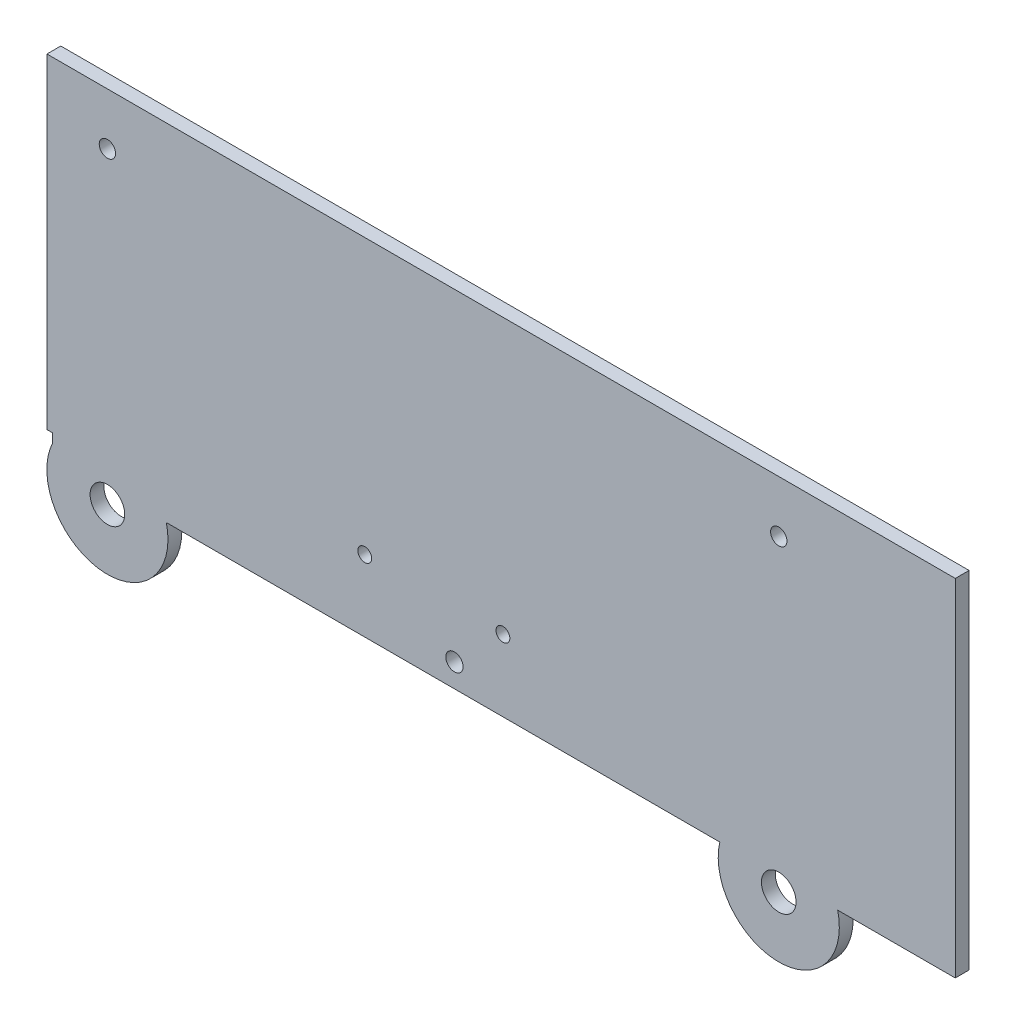
ISO-10303-21;
HEADER;
FILE_DESCRIPTION(('STEP AP214'),'2;1');
FILE_NAME('part.step','',(''),(''),'','','');
FILE_SCHEMA(('AUTOMOTIVE_DESIGN { 1 0 10303 214 1 1 1 1 }'));
ENDSEC;
DATA;
#1=APPLICATION_CONTEXT('core data for automotive mechanical design processes');
#2=APPLICATION_PROTOCOL_DEFINITION('international standard','automotive_design',2000,#1);
#3=PRODUCT_CONTEXT('',#1,'mechanical');
#4=PRODUCT('Part','Part','',(#3));
#5=PRODUCT_RELATED_PRODUCT_CATEGORY('part','',(#4));
#6=PRODUCT_DEFINITION_FORMATION('','',#4);
#7=PRODUCT_DEFINITION_CONTEXT('part definition',#1,'design');
#8=PRODUCT_DEFINITION('design','',#6,#7);
#9=PRODUCT_DEFINITION_SHAPE('','',#8);
#10=(LENGTH_UNIT() NAMED_UNIT(*) SI_UNIT(.MILLI.,.METRE.));
#11=(NAMED_UNIT(*) PLANE_ANGLE_UNIT() SI_UNIT($,.RADIAN.));
#12=(NAMED_UNIT(*) SI_UNIT($,.STERADIAN.) SOLID_ANGLE_UNIT());
#13=UNCERTAINTY_MEASURE_WITH_UNIT(LENGTH_MEASURE(1.E-05),#10,'distance_accuracy_value','');
#14=(GEOMETRIC_REPRESENTATION_CONTEXT(3) GLOBAL_UNCERTAINTY_ASSIGNED_CONTEXT((#13)) GLOBAL_UNIT_ASSIGNED_CONTEXT((#10,
#11,#12)) REPRESENTATION_CONTEXT('',''));
#15=CARTESIAN_POINT('',(0.,0.,0.));
#16=DIRECTION('',(0.,0.,1.));
#17=DIRECTION('',(1.,0.,0.));
#18=AXIS2_PLACEMENT_3D('',#15,#16,#17);
#19=CARTESIAN_POINT('',(0.,-31.75,-5.07492));
#20=DIRECTION('',(0.,-1.,0.));
#21=DIRECTION('',(0.,0.,-1.));
#22=AXIS2_PLACEMENT_3D('',#19,#20,#21);
#23=PLANE('',#22);
#24=DIRECTION('',(0.,0.,-1.));
#25=VECTOR('',#24,1.);
#26=CARTESIAN_POINT('',(101.426359202501,-31.75,0.));
#27=LINE('',#26,#25);
#28=CARTESIAN_POINT('',(101.426359202501,-31.75,0.));
#29=VERTEX_POINT('',#28);
#30=CARTESIAN_POINT('',(101.426359202501,-31.75,-5.07492));
#31=VERTEX_POINT('',#30);
#32=EDGE_CURVE('E209',#29,#31,#27,.T.);
#33=ORIENTED_EDGE('',*,*,#32,.F.);
#34=DIRECTION('',(1.,0.,0.));
#35=VECTOR('',#34,1.);
#36=CARTESIAN_POINT('',(0.,-31.75,0.));
#37=LINE('',#36,#35);
#38=CARTESIAN_POINT('',(-101.680359202501,-31.75,0.));
#39=VERTEX_POINT('',#38);
#40=EDGE_CURVE('E231',#39,#29,#37,.T.);
#41=ORIENTED_EDGE('',*,*,#40,.F.);
#42=DIRECTION('',(0.,0.,-1.));
#43=VECTOR('',#42,1.);
#44=CARTESIAN_POINT('',(-101.680359202501,-31.75,0.));
#45=LINE('',#44,#43);
#46=CARTESIAN_POINT('',(-101.680359202501,-31.75,-5.07492));
#47=VERTEX_POINT('',#46);
#48=EDGE_CURVE('E202',#47,#39,#45,.F.);
#49=ORIENTED_EDGE('',*,*,#48,.F.);
#50=DIRECTION('',(1.,0.,0.));
#51=VECTOR('',#50,1.);
#52=CARTESIAN_POINT('',(0.,-31.75,-5.07492));
#53=LINE('',#52,#51);
#54=EDGE_CURVE('E11',#47,#31,#53,.T.);
#55=ORIENTED_EDGE('',*,*,#54,.T.);
#56=EDGE_LOOP('',(#33,#41,#49,#55));
#57=FACE_BOUND('',#56,.T.);
#58=ADVANCED_FACE('F53',(#57),#23,.T.);
#59=CARTESIAN_POINT('',(-143.383,0.,-5.07492));
#60=DIRECTION('',(1.,0.,0.));
#61=DIRECTION('',(0.,0.,-1.));
#62=AXIS2_PLACEMENT_3D('',#59,#60,#61);
#63=PLANE('',#62);
#64=DIRECTION('',(0.,1.,0.));
#65=VECTOR('',#64,1.);
#66=CARTESIAN_POINT('',(-143.383,0.,0.));
#67=LINE('',#66,#65);
#68=CARTESIAN_POINT('',(-143.383,-27.2745686125639,0.));
#69=VERTEX_POINT('',#68);
#70=CARTESIAN_POINT('',(-143.383,-24.13,0.));
#71=VERTEX_POINT('',#70);
#72=EDGE_CURVE('E239',#69,#71,#67,.T.);
#73=ORIENTED_EDGE('',*,*,#72,.T.);
#74=DIRECTION('',(0.,0.,-1.));
#75=VECTOR('',#74,1.);
#76=CARTESIAN_POINT('',(-143.383,-24.13,-5.07492));
#77=LINE('',#76,#75);
#78=CARTESIAN_POINT('',(-143.383,-24.13,-5.07492));
#79=VERTEX_POINT('',#78);
#80=EDGE_CURVE('E133',#71,#79,#77,.T.);
#81=ORIENTED_EDGE('',*,*,#80,.T.);
#82=DIRECTION('',(0.,1.,0.));
#83=VECTOR('',#82,1.);
#84=CARTESIAN_POINT('',(-143.383,0.,-5.07492));
#85=LINE('',#84,#83);
#86=CARTESIAN_POINT('',(-143.383,-27.2745686125639,-5.07492));
#87=VERTEX_POINT('',#86);
#88=EDGE_CURVE('E63',#87,#79,#85,.T.);
#89=ORIENTED_EDGE('',*,*,#88,.F.);
#90=DIRECTION('',(0.,0.,-1.));
#91=VECTOR('',#90,1.);
#92=CARTESIAN_POINT('',(-143.383,-27.2745686125639,0.));
#93=LINE('',#92,#91);
#94=EDGE_CURVE('E190',#87,#69,#93,.F.);
#95=ORIENTED_EDGE('',*,*,#94,.T.);
#96=EDGE_LOOP('',(#73,#81,#89,#95));
#97=FACE_BOUND('',#96,.T.);
#98=ADVANCED_FACE('F305',(#97),#63,.F.);
#99=CARTESIAN_POINT('',(0.,95.25,-5.07492));
#100=DIRECTION('',(0.,-1.,0.));
#101=DIRECTION('',(0.,0.,-1.));
#102=AXIS2_PLACEMENT_3D('',#99,#100,#101);
#103=PLANE('',#102);
#104=DIRECTION('',(0.,0.,-1.));
#105=VECTOR('',#104,1.);
#106=CARTESIAN_POINT('',(187.833,95.25,0.));
#107=LINE('',#106,#105);
#108=CARTESIAN_POINT('',(187.833,95.25,0.));
#109=VERTEX_POINT('',#108);
#110=CARTESIAN_POINT('',(187.833,95.25,-5.07492));
#111=VERTEX_POINT('',#110);
#112=EDGE_CURVE('E217',#109,#111,#107,.T.);
#113=ORIENTED_EDGE('',*,*,#112,.T.);
#114=DIRECTION('',(1.,0.,0.));
#115=VECTOR('',#114,1.);
#116=CARTESIAN_POINT('',(0.,95.25,-5.07492));
#117=LINE('',#116,#115);
#118=CARTESIAN_POINT('',(-145.5039,95.25,-5.07492));
#119=VERTEX_POINT('',#118);
#120=EDGE_CURVE('E230',#119,#111,#117,.T.);
#121=ORIENTED_EDGE('',*,*,#120,.F.);
#122=DIRECTION('',(0.,0.,-1.));
#123=VECTOR('',#122,1.);
#124=CARTESIAN_POINT('',(-145.5039,95.25,0.));
#125=LINE('',#124,#123);
#126=CARTESIAN_POINT('',(-145.5039,95.25,0.));
#127=VERTEX_POINT('',#126);
#128=EDGE_CURVE('E148',#127,#119,#125,.T.);
#129=ORIENTED_EDGE('',*,*,#128,.F.);
#130=DIRECTION('',(1.,0.,0.));
#131=VECTOR('',#130,1.);
#132=CARTESIAN_POINT('',(0.,95.25,0.));
#133=LINE('',#132,#131);
#134=EDGE_CURVE('E153',#127,#109,#133,.T.);
#135=ORIENTED_EDGE('',*,*,#134,.T.);
#136=EDGE_LOOP('',(#113,#121,#129,#135));
#137=FACE_BOUND('',#136,.T.);
#138=ADVANCED_FACE('F55',(#137),#103,.F.);
#139=DIRECTION('',(0.,0.,-1.));
#140=VECTOR('',#139,1.);
#141=CARTESIAN_POINT('',(144.699640797499,-31.75,0.));
#142=LINE('',#141,#140);
#143=CARTESIAN_POINT('',(144.699640797499,-31.75,-5.07492));
#144=VERTEX_POINT('',#143);
#145=CARTESIAN_POINT('',(144.699640797499,-31.75,0.));
#146=VERTEX_POINT('',#145);
#147=EDGE_CURVE('E205',#144,#146,#142,.F.);
#148=ORIENTED_EDGE('',*,*,#147,.F.);
#149=CARTESIAN_POINT('',(187.833,-31.75,-5.07492));
#150=VERTEX_POINT('',#149);
#151=EDGE_CURVE('E65',#144,#150,#53,.T.);
#152=ORIENTED_EDGE('',*,*,#151,.T.);
#153=DIRECTION('',(0.,0.,-1.));
#154=VECTOR('',#153,1.);
#155=CARTESIAN_POINT('',(187.833,-31.75,0.));
#156=LINE('',#155,#154);
#157=CARTESIAN_POINT('',(187.833,-31.75,0.));
#158=VERTEX_POINT('',#157);
#159=EDGE_CURVE('E221',#158,#150,#156,.T.);
#160=ORIENTED_EDGE('',*,*,#159,.F.);
#161=EDGE_CURVE('E225',#146,#158,#37,.T.);
#162=ORIENTED_EDGE('',*,*,#161,.F.);
#163=EDGE_LOOP('',(#148,#152,#160,#162));
#164=FACE_BOUND('',#163,.T.);
#165=ADVANCED_FACE('F291',(#164),#23,.T.);
#166=CARTESIAN_POINT('',(0.,0.,-5.07492));
#167=DIRECTION('',(0.,0.,1.));
#168=DIRECTION('',(1.,0.,0.));
#169=AXIS2_PLACEMENT_3D('',#166,#167,#168);
#170=PLANE('',#169);
#171=CARTESIAN_POINT('',(21.8286627604245,-5.52563354151153,-5.07492));
#172=DIRECTION('',(0.,0.,-1.));
#173=DIRECTION('',(-1.,0.,0.));
#174=AXIS2_PLACEMENT_3D('',#171,#172,#173);
#175=CIRCLE('',#174,2.54);
#176=CARTESIAN_POINT('',(19.2886627604245,-5.52563354151153,-5.07492));
#177=VERTEX_POINT('',#176);
#178=EDGE_CURVE('E256',#177,#177,#175,.T.);
#179=ORIENTED_EDGE('',*,*,#178,.F.);
#180=EDGE_LOOP('',(#179));
#181=FACE_BOUND('',#180,.T.);
#182=CARTESIAN_POINT('',(-28.8696188052865,-5.52563354151153,-5.07492));
#183=DIRECTION('',(0.,0.,-1.));
#184=DIRECTION('',(-1.,0.,0.));
#185=AXIS2_PLACEMENT_3D('',#182,#183,#184);
#186=CIRCLE('',#185,2.54);
#187=CARTESIAN_POINT('',(-31.4096188052865,-5.52563354151153,-5.07492));
#188=VERTEX_POINT('',#187);
#189=EDGE_CURVE('E278',#188,#188,#186,.T.);
#190=ORIENTED_EDGE('',*,*,#189,.F.);
#191=EDGE_LOOP('',(#190));
#192=FACE_BOUND('',#191,.T.);
#193=CARTESIAN_POINT('',(4.04663740661451,-23.1777804676271,-5.07492));
#194=DIRECTION('',(0.,0.,-1.));
#195=DIRECTION('',(-1.,0.,0.));
#196=AXIS2_PLACEMENT_3D('',#193,#194,#195);
#197=CIRCLE('',#196,3.175);
#198=CARTESIAN_POINT('',(0.871637406614512,-23.1777804676271,-5.07492));
#199=VERTEX_POINT('',#198);
#200=EDGE_CURVE('E274',#199,#199,#197,.T.);
#201=ORIENTED_EDGE('',*,*,#200,.F.);
#202=EDGE_LOOP('',(#201));
#203=FACE_BOUND('',#202,.T.);
#204=CARTESIAN_POINT('',(123.063,76.2,-5.07492));
#205=DIRECTION('',(0.,0.,-1.));
#206=DIRECTION('',(-1.,0.,0.));
#207=AXIS2_PLACEMENT_3D('',#204,#205,#206);
#208=CIRCLE('',#207,3.00000000000001);
#209=CARTESIAN_POINT('',(120.063,76.2,-5.07491999999998));
#210=VERTEX_POINT('',#209);
#211=EDGE_CURVE('E248',#210,#210,#208,.T.);
#212=ORIENTED_EDGE('',*,*,#211,.F.);
#213=EDGE_LOOP('',(#212));
#214=FACE_BOUND('',#213,.T.);
#215=CARTESIAN_POINT('',(-123.317,76.2,-5.07492));
#216=DIRECTION('',(0.,0.,-1.));
#217=DIRECTION('',(-1.,0.,0.));
#218=AXIS2_PLACEMENT_3D('',#215,#216,#217);
#219=CIRCLE('',#218,2.99999999999999);
#220=CARTESIAN_POINT('',(-126.317,76.2,-5.07491999999998));
#221=VERTEX_POINT('',#220);
#222=EDGE_CURVE('E263',#221,#221,#219,.T.);
#223=ORIENTED_EDGE('',*,*,#222,.F.);
#224=EDGE_LOOP('',(#223));
#225=FACE_BOUND('',#224,.T.);
#226=CARTESIAN_POINT('',(-123.317,-36.83,-5.07492));
#227=DIRECTION('',(0.,0.,1.));
#228=DIRECTION('',(1.,0.,0.));
#229=AXIS2_PLACEMENT_3D('',#226,#227,#228);
#230=CIRCLE('',#229,6.35);
#231=CARTESIAN_POINT('',(-116.967,-36.83,-5.07492));
#232=VERTEX_POINT('',#231);
#233=EDGE_CURVE('E181',#232,#232,#230,.T.);
#234=ORIENTED_EDGE('',*,*,#233,.T.);
#235=EDGE_LOOP('',(#234));
#236=FACE_BOUND('',#235,.T.);
#237=CARTESIAN_POINT('',(123.063,-36.83,-5.07492));
#238=DIRECTION('',(0.,0.,1.));
#239=DIRECTION('',(1.,0.,0.));
#240=AXIS2_PLACEMENT_3D('',#237,#238,#239);
#241=CIRCLE('',#240,6.35);
#242=CARTESIAN_POINT('',(129.413,-36.83,-5.07492));
#243=VERTEX_POINT('',#242);
#244=EDGE_CURVE('E174',#243,#243,#241,.T.);
#245=ORIENTED_EDGE('',*,*,#244,.T.);
#246=EDGE_LOOP('',(#245));
#247=FACE_BOUND('',#246,.T.);
#248=ORIENTED_EDGE('',*,*,#88,.T.);
#249=DIRECTION('',(-1.,0.,0.));
#250=VECTOR('',#249,1.);
#251=CARTESIAN_POINT('',(-145.5039,-24.13,-5.07492));
#252=LINE('',#251,#250);
#253=CARTESIAN_POINT('',(-145.5039,-24.13,-5.07492));
#254=VERTEX_POINT('',#253);
#255=EDGE_CURVE('E159',#79,#254,#252,.T.);
#256=ORIENTED_EDGE('',*,*,#255,.T.);
#257=DIRECTION('',(0.,1.,0.));
#258=VECTOR('',#257,1.);
#259=CARTESIAN_POINT('',(-145.5039,95.25,-5.07492));
#260=LINE('',#259,#258);
#261=EDGE_CURVE('E140',#254,#119,#260,.T.);
#262=ORIENTED_EDGE('',*,*,#261,.T.);
#263=ORIENTED_EDGE('',*,*,#120,.T.);
#264=DIRECTION('',(0.,-1.,0.));
#265=VECTOR('',#264,1.);
#266=CARTESIAN_POINT('',(187.833,-31.75,-5.07492));
#267=LINE('',#266,#265);
#268=EDGE_CURVE('E212',#111,#150,#267,.T.);
#269=ORIENTED_EDGE('',*,*,#268,.T.);
#270=ORIENTED_EDGE('',*,*,#151,.F.);
#271=CARTESIAN_POINT('',(123.063,-36.83,-5.07492));
#272=DIRECTION('',(0.,0.,-1.));
#273=DIRECTION('',(-1.,0.,0.));
#274=AXIS2_PLACEMENT_3D('',#271,#272,#273);
#275=CIRCLE('',#274,22.225);
#276=EDGE_CURVE('E191',#144,#31,#275,.T.);
#277=ORIENTED_EDGE('',*,*,#276,.T.);
#278=ORIENTED_EDGE('',*,*,#54,.F.);
#279=CARTESIAN_POINT('',(-123.317,-36.83,-5.07492));
#280=DIRECTION('',(0.,0.,-1.));
#281=DIRECTION('',(-1.,0.,0.));
#282=AXIS2_PLACEMENT_3D('',#279,#280,#281);
#283=CIRCLE('',#282,22.225);
#284=EDGE_CURVE('E72',#47,#87,#283,.T.);
#285=ORIENTED_EDGE('',*,*,#284,.T.);
#286=EDGE_LOOP('',(#248,#256,#262,#263,#269,#270,#277,#278,#285));
#287=FACE_BOUND('',#286,.T.);
#288=ADVANCED_FACE('F288',(#181,#192,#203,#214,#225,#236,#247,#287),#170,.F.);
#289=CARTESIAN_POINT('',(0.,0.,0.));
#290=DIRECTION('',(0.,0.,1.));
#291=DIRECTION('',(1.,0.,0.));
#292=AXIS2_PLACEMENT_3D('',#289,#290,#291);
#293=PLANE('',#292);
#294=CARTESIAN_POINT('',(21.8286627604245,-5.52563354151153,0.));
#295=DIRECTION('',(0.,0.,1.));
#296=DIRECTION('',(1.,0.,0.));
#297=AXIS2_PLACEMENT_3D('',#294,#295,#296);
#298=CIRCLE('',#297,2.54);
#299=CARTESIAN_POINT('',(24.3686627604245,-5.52563354151153,0.));
#300=VERTEX_POINT('',#299);
#301=EDGE_CURVE('E57',#300,#300,#298,.T.);
#302=ORIENTED_EDGE('',*,*,#301,.F.);
#303=EDGE_LOOP('',(#302));
#304=FACE_BOUND('',#303,.T.);
#305=CARTESIAN_POINT('',(-28.8696188052865,-5.52563354151153,0.));
#306=DIRECTION('',(0.,0.,1.));
#307=DIRECTION('',(1.,0.,0.));
#308=AXIS2_PLACEMENT_3D('',#305,#306,#307);
#309=CIRCLE('',#308,2.54);
#310=CARTESIAN_POINT('',(-26.3296188052865,-5.52563354151153,0.));
#311=VERTEX_POINT('',#310);
#312=EDGE_CURVE('E255',#311,#311,#309,.T.);
#313=ORIENTED_EDGE('',*,*,#312,.F.);
#314=EDGE_LOOP('',(#313));
#315=FACE_BOUND('',#314,.T.);
#316=CARTESIAN_POINT('',(4.04663740661451,-23.1777804676271,0.));
#317=DIRECTION('',(0.,0.,1.));
#318=DIRECTION('',(1.,0.,0.));
#319=AXIS2_PLACEMENT_3D('',#316,#317,#318);
#320=CIRCLE('',#319,3.175);
#321=CARTESIAN_POINT('',(7.22163740661451,-23.1777804676271,0.));
#322=VERTEX_POINT('',#321);
#323=EDGE_CURVE('E252',#322,#322,#320,.T.);
#324=ORIENTED_EDGE('',*,*,#323,.F.);
#325=EDGE_LOOP('',(#324));
#326=FACE_BOUND('',#325,.T.);
#327=CARTESIAN_POINT('',(123.063,76.2,0.));
#328=DIRECTION('',(0.,0.,1.));
#329=DIRECTION('',(1.,0.,0.));
#330=AXIS2_PLACEMENT_3D('',#327,#328,#329);
#331=CIRCLE('',#330,3.00000000000001);
#332=CARTESIAN_POINT('',(120.063,76.2,0.));
#333=VERTEX_POINT('',#332);
#334=EDGE_CURVE('E162',#333,#333,#331,.T.);
#335=ORIENTED_EDGE('',*,*,#334,.F.);
#336=EDGE_LOOP('',(#335));
#337=FACE_BOUND('',#336,.T.);
#338=CARTESIAN_POINT('',(-123.317,76.2,0.));
#339=DIRECTION('',(0.,0.,1.));
#340=DIRECTION('',(1.,0.,0.));
#341=AXIS2_PLACEMENT_3D('',#338,#339,#340);
#342=CIRCLE('',#341,2.99999999999999);
#343=CARTESIAN_POINT('',(-126.317,76.2,0.));
#344=VERTEX_POINT('',#343);
#345=EDGE_CURVE('E244',#344,#344,#342,.T.);
#346=ORIENTED_EDGE('',*,*,#345,.F.);
#347=EDGE_LOOP('',(#346));
#348=FACE_BOUND('',#347,.T.);
#349=ORIENTED_EDGE('',*,*,#134,.F.);
#350=DIRECTION('',(0.,1.,0.));
#351=VECTOR('',#350,1.);
#352=CARTESIAN_POINT('',(-145.5039,95.25,0.));
#353=LINE('',#352,#351);
#354=CARTESIAN_POINT('',(-145.5039,-24.13,0.));
#355=VERTEX_POINT('',#354);
#356=EDGE_CURVE('E139',#355,#127,#353,.T.);
#357=ORIENTED_EDGE('',*,*,#356,.F.);
#358=DIRECTION('',(-1.,0.,0.));
#359=VECTOR('',#358,1.);
#360=CARTESIAN_POINT('',(-145.5039,-24.13,0.));
#361=LINE('',#360,#359);
#362=EDGE_CURVE('E127',#71,#355,#361,.T.);
#363=ORIENTED_EDGE('',*,*,#362,.F.);
#364=ORIENTED_EDGE('',*,*,#72,.F.);
#365=CARTESIAN_POINT('',(-123.317,-36.83,0.));
#366=DIRECTION('',(0.,0.,-1.));
#367=DIRECTION('',(-1.,0.,0.));
#368=AXIS2_PLACEMENT_3D('',#365,#366,#367);
#369=CIRCLE('',#368,22.225);
#370=EDGE_CURVE('E185',#39,#69,#369,.T.);
#371=ORIENTED_EDGE('',*,*,#370,.F.);
#372=ORIENTED_EDGE('',*,*,#40,.T.);
#373=CARTESIAN_POINT('',(123.063,-36.83,0.));
#374=DIRECTION('',(0.,0.,-1.));
#375=DIRECTION('',(-1.,0.,0.));
#376=AXIS2_PLACEMENT_3D('',#373,#374,#375);
#377=CIRCLE('',#376,22.225);
#378=EDGE_CURVE('E186',#146,#29,#377,.T.);
#379=ORIENTED_EDGE('',*,*,#378,.F.);
#380=ORIENTED_EDGE('',*,*,#161,.T.);
#381=DIRECTION('',(0.,-1.,0.));
#382=VECTOR('',#381,1.);
#383=CARTESIAN_POINT('',(187.833,-31.75,0.));
#384=LINE('',#383,#382);
#385=EDGE_CURVE('E213',#109,#158,#384,.T.);
#386=ORIENTED_EDGE('',*,*,#385,.F.);
#387=EDGE_LOOP('',(#349,#357,#363,#364,#371,#372,#379,#380,#386));
#388=FACE_BOUND('',#387,.T.);
#389=CARTESIAN_POINT('',(-123.317,-36.83,0.));
#390=DIRECTION('',(0.,0.,1.));
#391=DIRECTION('',(1.,0.,0.));
#392=AXIS2_PLACEMENT_3D('',#389,#390,#391);
#393=CIRCLE('',#392,6.35);
#394=CARTESIAN_POINT('',(-116.967,-36.83,0.));
#395=VERTEX_POINT('',#394);
#396=EDGE_CURVE('E170',#395,#395,#393,.T.);
#397=ORIENTED_EDGE('',*,*,#396,.F.);
#398=EDGE_LOOP('',(#397));
#399=FACE_BOUND('',#398,.T.);
#400=CARTESIAN_POINT('',(123.063,-36.83,0.));
#401=DIRECTION('',(0.,0.,1.));
#402=DIRECTION('',(1.,0.,0.));
#403=AXIS2_PLACEMENT_3D('',#400,#401,#402);
#404=CIRCLE('',#403,6.35);
#405=CARTESIAN_POINT('',(129.413,-36.83,0.));
#406=VERTEX_POINT('',#405);
#407=EDGE_CURVE('E169',#406,#406,#404,.T.);
#408=ORIENTED_EDGE('',*,*,#407,.F.);
#409=EDGE_LOOP('',(#408));
#410=FACE_BOUND('',#409,.T.);
#411=ADVANCED_FACE('F150',(#304,#315,#326,#337,#348,#388,#399,#410),#293,.T.);
#412=CARTESIAN_POINT('',(187.833,-31.75,0.));
#413=DIRECTION('',(1.,0.,0.));
#414=DIRECTION('',(0.,0.,-1.));
#415=AXIS2_PLACEMENT_3D('',#412,#413,#414);
#416=PLANE('',#415);
#417=ORIENTED_EDGE('',*,*,#268,.F.);
#418=ORIENTED_EDGE('',*,*,#112,.F.);
#419=ORIENTED_EDGE('',*,*,#385,.T.);
#420=ORIENTED_EDGE('',*,*,#159,.T.);
#421=EDGE_LOOP('',(#417,#418,#419,#420));
#422=FACE_BOUND('',#421,.T.);
#423=ADVANCED_FACE('F320',(#422),#416,.T.);
#424=CARTESIAN_POINT('',(123.063,-36.83,0.));
#425=DIRECTION('',(0.,0.,-1.));
#426=DIRECTION('',(-1.,0.,0.));
#427=AXIS2_PLACEMENT_3D('',#424,#425,#426);
#428=CYLINDRICAL_SURFACE('',#427,22.225);
#429=ORIENTED_EDGE('',*,*,#378,.T.);
#430=ORIENTED_EDGE('',*,*,#32,.T.);
#431=ORIENTED_EDGE('',*,*,#276,.F.);
#432=ORIENTED_EDGE('',*,*,#147,.T.);
#433=EDGE_LOOP('',(#429,#430,#431,#432));
#434=FACE_BOUND('',#433,.T.);
#435=ADVANCED_FACE('F312',(#434),#428,.T.);
#436=CARTESIAN_POINT('',(-123.317,-36.83,0.));
#437=DIRECTION('',(0.,0.,-1.));
#438=DIRECTION('',(-1.,0.,0.));
#439=AXIS2_PLACEMENT_3D('',#436,#437,#438);
#440=CYLINDRICAL_SURFACE('',#439,22.225);
#441=ORIENTED_EDGE('',*,*,#284,.F.);
#442=ORIENTED_EDGE('',*,*,#48,.T.);
#443=ORIENTED_EDGE('',*,*,#370,.T.);
#444=ORIENTED_EDGE('',*,*,#94,.F.);
#445=EDGE_LOOP('',(#441,#442,#443,#444));
#446=FACE_BOUND('',#445,.T.);
#447=ADVANCED_FACE('F337',(#446),#440,.T.);
#448=CARTESIAN_POINT('',(123.063,-36.83,-5.588));
#449=DIRECTION('',(0.,0.,1.));
#450=DIRECTION('',(1.,0.,0.));
#451=AXIS2_PLACEMENT_3D('',#448,#449,#450);
#452=CYLINDRICAL_SURFACE('',#451,6.35);
#453=ORIENTED_EDGE('',*,*,#407,.T.);
#454=EDGE_LOOP('',(#453));
#455=FACE_BOUND('',#454,.T.);
#456=ORIENTED_EDGE('',*,*,#244,.F.);
#457=EDGE_LOOP('',(#456));
#458=FACE_BOUND('',#457,.T.);
#459=ADVANCED_FACE('F340',(#455,#458),#452,.F.);
#460=CARTESIAN_POINT('',(-123.317,-36.83,-5.588));
#461=DIRECTION('',(0.,0.,1.));
#462=DIRECTION('',(1.,0.,0.));
#463=AXIS2_PLACEMENT_3D('',#460,#461,#462);
#464=CYLINDRICAL_SURFACE('',#463,6.35);
#465=ORIENTED_EDGE('',*,*,#396,.T.);
#466=EDGE_LOOP('',(#465));
#467=FACE_BOUND('',#466,.T.);
#468=ORIENTED_EDGE('',*,*,#233,.F.);
#469=EDGE_LOOP('',(#468));
#470=FACE_BOUND('',#469,.T.);
#471=ADVANCED_FACE('F345',(#467,#470),#464,.F.);
#472=CARTESIAN_POINT('',(-145.5039,-24.13,0.));
#473=DIRECTION('',(0.,-1.,0.));
#474=DIRECTION('',(0.,0.,-1.));
#475=AXIS2_PLACEMENT_3D('',#472,#473,#474);
#476=PLANE('',#475);
#477=ORIENTED_EDGE('',*,*,#80,.F.);
#478=ORIENTED_EDGE('',*,*,#362,.T.);
#479=DIRECTION('',(0.,0.,-1.));
#480=VECTOR('',#479,1.);
#481=CARTESIAN_POINT('',(-145.5039,-24.13,0.));
#482=LINE('',#481,#480);
#483=EDGE_CURVE('E130',#355,#254,#482,.T.);
#484=ORIENTED_EDGE('',*,*,#483,.T.);
#485=ORIENTED_EDGE('',*,*,#255,.F.);
#486=EDGE_LOOP('',(#477,#478,#484,#485));
#487=FACE_BOUND('',#486,.T.);
#488=ADVANCED_FACE('F129',(#487),#476,.T.);
#489=CARTESIAN_POINT('',(-145.5039,95.25,0.));
#490=DIRECTION('',(-1.,0.,0.));
#491=DIRECTION('',(0.,-1.,0.));
#492=AXIS2_PLACEMENT_3D('',#489,#490,#491);
#493=PLANE('',#492);
#494=ORIENTED_EDGE('',*,*,#261,.F.);
#495=ORIENTED_EDGE('',*,*,#483,.F.);
#496=ORIENTED_EDGE('',*,*,#356,.T.);
#497=ORIENTED_EDGE('',*,*,#128,.T.);
#498=EDGE_LOOP('',(#494,#495,#496,#497));
#499=FACE_BOUND('',#498,.T.);
#500=ADVANCED_FACE('F144',(#499),#493,.T.);
#501=CARTESIAN_POINT('',(-123.317,76.2,394.97508));
#502=DIRECTION('',(0.,0.,-1.));
#503=DIRECTION('',(-1.,0.,0.));
#504=AXIS2_PLACEMENT_3D('',#501,#502,#503);
#505=CYLINDRICAL_SURFACE('',#504,2.99999999999999);
#506=CARTESIAN_POINT('',(-126.317,76.2,0.));
#507=CARTESIAN_POINT('',(-126.317,76.2,-0.0528637500000021));
#508=CARTESIAN_POINT('',(-126.317,76.2,-0.105727500000004));
#509=CARTESIAN_POINT('',(-126.317,76.2,-0.211455000000009));
#510=CARTESIAN_POINT('',(-126.317,76.2,-0.264318750000011));
#511=CARTESIAN_POINT('',(-126.317,76.2,-0.370046250000015));
#512=CARTESIAN_POINT('',(-126.317,76.2,-0.422910000000017));
#513=CARTESIAN_POINT('',(-126.317,76.2,-0.528637500000021));
#514=CARTESIAN_POINT('',(-126.317,76.2,-0.581501250000023));
#515=CARTESIAN_POINT('',(-126.317,76.2,-0.687228750000009));
#516=CARTESIAN_POINT('',(-126.317,76.2,-0.740092499999993));
#517=CARTESIAN_POINT('',(-126.317,76.2,-0.845819999999979));
#518=CARTESIAN_POINT('',(-126.317,76.2,-0.898683749999981));
#519=CARTESIAN_POINT('',(-126.317,76.2,-1.00441124999999));
#520=CARTESIAN_POINT('',(-126.317,76.2,-1.05727499999999));
#521=CARTESIAN_POINT('',(-126.317,76.2,-1.16300249999999));
#522=CARTESIAN_POINT('',(-126.317,76.2,-1.21586624999999));
#523=CARTESIAN_POINT('',(-126.317,76.2,-1.32159375));
#524=CARTESIAN_POINT('',(-126.317,76.2,-1.3744575));
#525=CARTESIAN_POINT('',(-126.317,76.2,-1.480185));
#526=CARTESIAN_POINT('',(-126.317,76.2,-1.53304875000001));
#527=CARTESIAN_POINT('',(-126.317,76.2,-1.63877625000001));
#528=CARTESIAN_POINT('',(-126.317,76.2,-1.69164000000001));
#529=CARTESIAN_POINT('',(-126.317,76.2,-1.7973675));
#530=CARTESIAN_POINT('',(-126.317,76.2,-1.85023124999998));
#531=CARTESIAN_POINT('',(-126.317,76.2,-1.95595874999997));
#532=CARTESIAN_POINT('',(-126.317,76.2,-2.00882249999997));
#533=CARTESIAN_POINT('',(-126.317,76.2,-2.11454999999997));
#534=CARTESIAN_POINT('',(-126.317,76.2,-2.16741374999998));
#535=CARTESIAN_POINT('',(-126.317,76.2,-2.27314124999998));
#536=CARTESIAN_POINT('',(-126.317,76.2,-2.32600499999998));
#537=CARTESIAN_POINT('',(-126.317,76.2,-2.43173249999999));
#538=CARTESIAN_POINT('',(-126.317,76.2,-2.48459624999999));
#539=CARTESIAN_POINT('',(-126.317,76.2,-2.59032374999999));
#540=CARTESIAN_POINT('',(-126.317,76.2,-2.6431875));
#541=CARTESIAN_POINT('',(-126.317,76.2,-2.748915));
#542=CARTESIAN_POINT('',(-126.317,76.2,-2.80177875));
#543=CARTESIAN_POINT('',(-126.317,76.2,-2.90750625000001));
#544=CARTESIAN_POINT('',(-126.317,76.2,-2.96037000000001));
#545=CARTESIAN_POINT('',(-126.317,76.2,-3.06609750000001));
#546=CARTESIAN_POINT('',(-126.317,76.2,-3.11896125000002));
#547=CARTESIAN_POINT('',(-126.317,76.2,-3.22468875));
#548=CARTESIAN_POINT('',(-126.317,76.2,-3.27755249999998));
#549=CARTESIAN_POINT('',(-126.317,76.2,-3.38327999999997));
#550=CARTESIAN_POINT('',(-126.317,76.2,-3.43614374999997));
#551=CARTESIAN_POINT('',(-126.317,76.2,-3.54187124999998));
#552=CARTESIAN_POINT('',(-126.317,76.2,-3.59473499999998));
#553=CARTESIAN_POINT('',(-126.317,76.2,-3.70046249999998));
#554=CARTESIAN_POINT('',(-126.317,76.2,-3.75332624999999));
#555=CARTESIAN_POINT('',(-126.317,76.2,-3.85905374999999));
#556=CARTESIAN_POINT('',(-126.317,76.2,-3.91191749999999));
#557=CARTESIAN_POINT('',(-126.317,76.2,-4.017645));
#558=CARTESIAN_POINT('',(-126.317,76.2,-4.07050875));
#559=CARTESIAN_POINT('',(-126.317,76.2,-4.17623625));
#560=CARTESIAN_POINT('',(-126.317,76.2,-4.2291));
#561=CARTESIAN_POINT('',(-126.317,76.2,-4.33482749999999));
#562=CARTESIAN_POINT('',(-126.317,76.2,-4.38769124999997));
#563=CARTESIAN_POINT('',(-126.317,76.2,-4.49341874999996));
#564=CARTESIAN_POINT('',(-126.317,76.2,-4.54628249999996));
#565=CARTESIAN_POINT('',(-126.317,76.2,-4.65200999999997));
#566=CARTESIAN_POINT('',(-126.317,76.2,-4.70487374999997));
#567=CARTESIAN_POINT('',(-126.317,76.2,-4.81060124999997));
#568=CARTESIAN_POINT('',(-126.317,76.2,-4.86346499999997));
#569=CARTESIAN_POINT('',(-126.317,76.2,-4.96919249999998));
#570=CARTESIAN_POINT('',(-126.317,76.2,-5.02205624999998));
#571=CARTESIAN_POINT('',(-126.317,76.2,-5.07491999999998));
#572=B_SPLINE_CURVE_WITH_KNOTS('',3,(#506,#507,#508,#509,#510,#511,#512,#513,#514,#515,#516,
#517,#518,#519,#520,#521,#522,#523,#524,#525,#526,#527,#528,#529,#530,#531,#532,#533,#534,#535,
#536,#537,#538,#539,#540,#541,#542,#543,#544,#545,#546,#547,#548,#549,#550,#551,#552,#553,#554,
#555,#556,#557,#558,#559,#560,#561,#562,#563,#564,#565,#566,#567,#568,#569,#570,#571),
.UNSPECIFIED.,.F.,.F.,(4,2,2,2,2,2,2,2,2,2,2,2,2,2,2,2,2,2,2,2,2,2,2,2,2,2,2,2,2,2,2,2,4),(0.,
0.158591250000006,0.317182500000013,0.475773750000019,0.634365000000026,0.792956249999976,
0.951547499999983,1.11013874999999,1.26873,1.42732125,1.58591250000001,1.74450375000001,
1.90309499999997,2.06168624999997,2.22027749999998,2.37886874999998,2.53745999999999,2.69605125,
2.8546425,3.01323375000001,3.17182500000002,3.33041624999997,3.48900749999997,3.64759874999998,
3.80618999999999,3.96478124999999,4.1233725,4.28196375000001,4.44055499999996,4.59914624999996,
4.75773749999997,4.91632874999998,5.07491999999998),.UNSPECIFIED.);
#573=EDGE_CURVE('BSEAM354',#344,#221,#572,.T.);
#574=ORIENTED_EDGE('',*,*,#345,.T.);
#575=ORIENTED_EDGE('',*,*,#222,.T.);
#576=ORIENTED_EDGE('',*,*,#573,.T.);
#577=ORIENTED_EDGE('',*,*,#573,.F.);
#578=EDGE_LOOP('',(#574,#576,#575,#577));
#579=FACE_BOUND('',#578,.T.);
#580=ADVANCED_FACE('F354',(#579),#505,.F.);
#581=CARTESIAN_POINT('',(123.063,76.2,394.97508));
#582=DIRECTION('',(0.,0.,-1.));
#583=DIRECTION('',(-1.,0.,0.));
#584=AXIS2_PLACEMENT_3D('',#581,#582,#583);
#585=CYLINDRICAL_SURFACE('',#584,3.00000000000001);
#586=CARTESIAN_POINT('',(120.063,76.2,0.));
#587=CARTESIAN_POINT('',(120.063,76.2,-0.0528637500000021));
#588=CARTESIAN_POINT('',(120.063,76.2,-0.105727500000004));
#589=CARTESIAN_POINT('',(120.063,76.2,-0.211455000000009));
#590=CARTESIAN_POINT('',(120.063,76.2,-0.264318750000011));
#591=CARTESIAN_POINT('',(120.063,76.2,-0.370046250000015));
#592=CARTESIAN_POINT('',(120.063,76.2,-0.422910000000017));
#593=CARTESIAN_POINT('',(120.063,76.2,-0.528637500000021));
#594=CARTESIAN_POINT('',(120.063,76.2,-0.581501250000023));
#595=CARTESIAN_POINT('',(120.063,76.2,-0.687228750000009));
#596=CARTESIAN_POINT('',(120.063,76.2,-0.740092499999993));
#597=CARTESIAN_POINT('',(120.063,76.2,-0.845819999999979));
#598=CARTESIAN_POINT('',(120.063,76.2,-0.898683749999981));
#599=CARTESIAN_POINT('',(120.063,76.2,-1.00441124999999));
#600=CARTESIAN_POINT('',(120.063,76.2,-1.05727499999999));
#601=CARTESIAN_POINT('',(120.063,76.2,-1.16300249999999));
#602=CARTESIAN_POINT('',(120.063,76.2,-1.21586624999999));
#603=CARTESIAN_POINT('',(120.063,76.2,-1.32159375));
#604=CARTESIAN_POINT('',(120.063,76.2,-1.3744575));
#605=CARTESIAN_POINT('',(120.063,76.2,-1.480185));
#606=CARTESIAN_POINT('',(120.063,76.2,-1.53304875000001));
#607=CARTESIAN_POINT('',(120.063,76.2,-1.63877625000001));
#608=CARTESIAN_POINT('',(120.063,76.2,-1.69164000000001));
#609=CARTESIAN_POINT('',(120.063,76.2,-1.7973675));
#610=CARTESIAN_POINT('',(120.063,76.2,-1.85023124999998));
#611=CARTESIAN_POINT('',(120.063,76.2,-1.95595874999997));
#612=CARTESIAN_POINT('',(120.063,76.2,-2.00882249999997));
#613=CARTESIAN_POINT('',(120.063,76.2,-2.11454999999997));
#614=CARTESIAN_POINT('',(120.063,76.2,-2.16741374999998));
#615=CARTESIAN_POINT('',(120.063,76.2,-2.27314124999998));
#616=CARTESIAN_POINT('',(120.063,76.2,-2.32600499999998));
#617=CARTESIAN_POINT('',(120.063,76.2,-2.43173249999999));
#618=CARTESIAN_POINT('',(120.063,76.2,-2.48459624999999));
#619=CARTESIAN_POINT('',(120.063,76.2,-2.59032374999999));
#620=CARTESIAN_POINT('',(120.063,76.2,-2.6431875));
#621=CARTESIAN_POINT('',(120.063,76.2,-2.748915));
#622=CARTESIAN_POINT('',(120.063,76.2,-2.80177875));
#623=CARTESIAN_POINT('',(120.063,76.2,-2.90750625000001));
#624=CARTESIAN_POINT('',(120.063,76.2,-2.96037000000001));
#625=CARTESIAN_POINT('',(120.063,76.2,-3.06609750000001));
#626=CARTESIAN_POINT('',(120.063,76.2,-3.11896125000002));
#627=CARTESIAN_POINT('',(120.063,76.2,-3.22468875));
#628=CARTESIAN_POINT('',(120.063,76.2,-3.27755249999998));
#629=CARTESIAN_POINT('',(120.063,76.2,-3.38327999999997));
#630=CARTESIAN_POINT('',(120.063,76.2,-3.43614374999997));
#631=CARTESIAN_POINT('',(120.063,76.2,-3.54187124999998));
#632=CARTESIAN_POINT('',(120.063,76.2,-3.59473499999998));
#633=CARTESIAN_POINT('',(120.063,76.2,-3.70046249999998));
#634=CARTESIAN_POINT('',(120.063,76.2,-3.75332624999999));
#635=CARTESIAN_POINT('',(120.063,76.2,-3.85905374999999));
#636=CARTESIAN_POINT('',(120.063,76.2,-3.91191749999999));
#637=CARTESIAN_POINT('',(120.063,76.2,-4.017645));
#638=CARTESIAN_POINT('',(120.063,76.2,-4.07050875));
#639=CARTESIAN_POINT('',(120.063,76.2,-4.17623625));
#640=CARTESIAN_POINT('',(120.063,76.2,-4.2291));
#641=CARTESIAN_POINT('',(120.063,76.2,-4.33482749999999));
#642=CARTESIAN_POINT('',(120.063,76.2,-4.38769124999997));
#643=CARTESIAN_POINT('',(120.063,76.2,-4.49341874999996));
#644=CARTESIAN_POINT('',(120.063,76.2,-4.54628249999996));
#645=CARTESIAN_POINT('',(120.063,76.2,-4.65200999999997));
#646=CARTESIAN_POINT('',(120.063,76.2,-4.70487374999997));
#647=CARTESIAN_POINT('',(120.063,76.2,-4.81060124999997));
#648=CARTESIAN_POINT('',(120.063,76.2,-4.86346499999997));
#649=CARTESIAN_POINT('',(120.063,76.2,-4.96919249999998));
#650=CARTESIAN_POINT('',(120.063,76.2,-5.02205624999998));
#651=CARTESIAN_POINT('',(120.063,76.2,-5.07491999999998));
#652=B_SPLINE_CURVE_WITH_KNOTS('',3,(#586,#587,#588,#589,#590,#591,#592,#593,#594,#595,#596,
#597,#598,#599,#600,#601,#602,#603,#604,#605,#606,#607,#608,#609,#610,#611,#612,#613,#614,#615,
#616,#617,#618,#619,#620,#621,#622,#623,#624,#625,#626,#627,#628,#629,#630,#631,#632,#633,#634,
#635,#636,#637,#638,#639,#640,#641,#642,#643,#644,#645,#646,#647,#648,#649,#650,#651),
.UNSPECIFIED.,.F.,.F.,(4,2,2,2,2,2,2,2,2,2,2,2,2,2,2,2,2,2,2,2,2,2,2,2,2,2,2,2,2,2,2,2,4),(0.,
0.158591250000006,0.317182500000013,0.475773750000019,0.634365000000026,0.792956249999976,
0.951547499999983,1.11013874999999,1.26873,1.42732125,1.58591250000001,1.74450375000001,
1.90309499999997,2.06168624999997,2.22027749999998,2.37886874999998,2.53745999999999,2.69605125,
2.8546425,3.01323375000001,3.17182500000002,3.33041624999997,3.48900749999997,3.64759874999998,
3.80618999999999,3.96478124999999,4.1233725,4.28196375000001,4.44055499999996,4.59914624999996,
4.75773749999997,4.91632874999998,5.07491999999998),.UNSPECIFIED.);
#653=EDGE_CURVE('BSEAM357',#333,#210,#652,.T.);
#654=ORIENTED_EDGE('',*,*,#334,.T.);
#655=ORIENTED_EDGE('',*,*,#211,.T.);
#656=ORIENTED_EDGE('',*,*,#653,.T.);
#657=ORIENTED_EDGE('',*,*,#653,.F.);
#658=EDGE_LOOP('',(#654,#656,#655,#657));
#659=FACE_BOUND('',#658,.T.);
#660=ADVANCED_FACE('F357',(#659),#585,.F.);
#661=CARTESIAN_POINT('',(4.04663740661451,-23.1777804676271,1.27508));
#662=DIRECTION('',(0.,0.,-1.));
#663=DIRECTION('',(-1.,0.,0.));
#664=AXIS2_PLACEMENT_3D('',#661,#662,#663);
#665=CYLINDRICAL_SURFACE('',#664,3.175);
#666=ORIENTED_EDGE('',*,*,#323,.T.);
#667=EDGE_LOOP('',(#666));
#668=FACE_BOUND('',#667,.T.);
#669=ORIENTED_EDGE('',*,*,#200,.T.);
#670=EDGE_LOOP('',(#669));
#671=FACE_BOUND('',#670,.T.);
#672=ADVANCED_FACE('F361',(#668,#671),#665,.F.);
#673=CARTESIAN_POINT('',(-28.8696188052865,-5.52563354151153,1.27508));
#674=DIRECTION('',(0.,0.,-1.));
#675=DIRECTION('',(-1.,0.,0.));
#676=AXIS2_PLACEMENT_3D('',#673,#674,#675);
#677=CYLINDRICAL_SURFACE('',#676,2.54);
#678=ORIENTED_EDGE('',*,*,#312,.T.);
#679=EDGE_LOOP('',(#678));
#680=FACE_BOUND('',#679,.T.);
#681=ORIENTED_EDGE('',*,*,#189,.T.);
#682=EDGE_LOOP('',(#681));
#683=FACE_BOUND('',#682,.T.);
#684=ADVANCED_FACE('F365',(#680,#683),#677,.F.);
#685=CARTESIAN_POINT('',(21.8286627604245,-5.52563354151153,1.27508));
#686=DIRECTION('',(0.,0.,-1.));
#687=DIRECTION('',(-1.,0.,0.));
#688=AXIS2_PLACEMENT_3D('',#685,#686,#687);
#689=CYLINDRICAL_SURFACE('',#688,2.54);
#690=ORIENTED_EDGE('',*,*,#301,.T.);
#691=EDGE_LOOP('',(#690));
#692=FACE_BOUND('',#691,.T.);
#693=ORIENTED_EDGE('',*,*,#178,.T.);
#694=EDGE_LOOP('',(#693));
#695=FACE_BOUND('',#694,.T.);
#696=ADVANCED_FACE('F286',(#692,#695),#689,.F.);
#697=CLOSED_SHELL('',(#58,#98,#138,#165,#288,#411,#423,#435,#447,#459,#471,#488,#500,#580,#660,
#672,#684,#696));
#698=MANIFOLD_SOLID_BREP('B2',#697);
#699=ADVANCED_BREP_SHAPE_REPRESENTATION('',(#18,#698),#14);
#700=SHAPE_DEFINITION_REPRESENTATION(#9,#699);
ENDSEC;
END-ISO-10303-21;
